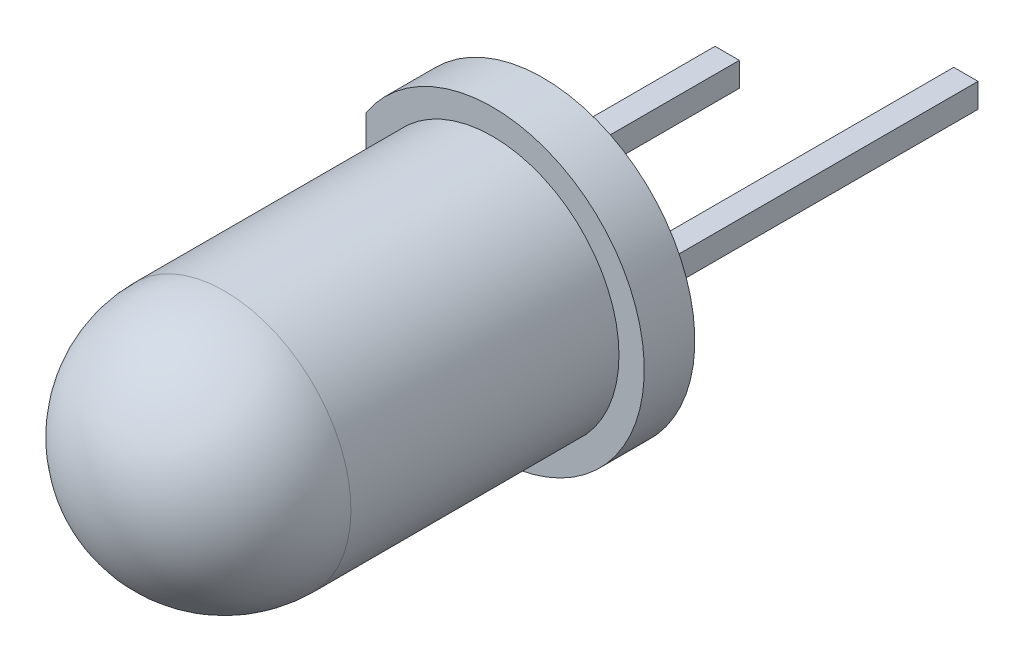
ISO-10303-21;
HEADER;
FILE_DESCRIPTION(('STEP AP214'),'2;1');
FILE_NAME('part.step','',(''),(''),'','','');
FILE_SCHEMA(('AUTOMOTIVE_DESIGN { 1 0 10303 214 1 1 1 1 }'));
ENDSEC;
DATA;
#1=APPLICATION_CONTEXT('core data for automotive mechanical design processes');
#2=APPLICATION_PROTOCOL_DEFINITION('international standard','automotive_design',2000,#1);
#3=PRODUCT_CONTEXT('',#1,'mechanical');
#4=PRODUCT('Part','Part','',(#3));
#5=PRODUCT_RELATED_PRODUCT_CATEGORY('part','',(#4));
#6=PRODUCT_DEFINITION_FORMATION('','',#4);
#7=PRODUCT_DEFINITION_CONTEXT('part definition',#1,'design');
#8=PRODUCT_DEFINITION('design','',#6,#7);
#9=PRODUCT_DEFINITION_SHAPE('','',#8);
#10=(LENGTH_UNIT() NAMED_UNIT(*) SI_UNIT(.MILLI.,.METRE.));
#11=(NAMED_UNIT(*) PLANE_ANGLE_UNIT() SI_UNIT($,.RADIAN.));
#12=(NAMED_UNIT(*) SI_UNIT($,.STERADIAN.) SOLID_ANGLE_UNIT());
#13=UNCERTAINTY_MEASURE_WITH_UNIT(LENGTH_MEASURE(1.E-05),#10,'distance_accuracy_value','');
#14=(GEOMETRIC_REPRESENTATION_CONTEXT(3) GLOBAL_UNCERTAINTY_ASSIGNED_CONTEXT((#13)) GLOBAL_UNIT_ASSIGNED_CONTEXT((#10,
#11,#12)) REPRESENTATION_CONTEXT('',''));
#15=CARTESIAN_POINT('',(0.,0.,0.));
#16=DIRECTION('',(0.,0.,1.));
#17=DIRECTION('',(1.,0.,0.));
#18=AXIS2_PLACEMENT_3D('',#15,#16,#17);
#19=CARTESIAN_POINT('',(-0.0499999999999997,0.,4.26666666666667));
#20=DIRECTION('',(0.,0.,1.));
#21=DIRECTION('',(-1.,0.,0.));
#22=AXIS2_PLACEMENT_3D('',#19,#20,#21);
#23=SPHERICAL_SURFACE('',#22,0.566666666666667);
#24=CARTESIAN_POINT('',(-0.0499999999999997,-0.24,4.26666666666667));
#25=DIRECTION('',(0.,1.,0.));
#26=DIRECTION('',(0.,0.,1.));
#27=AXIS2_PLACEMENT_3D('',#24,#25,#26);
#28=CIRCLE('',#27,0.513333333333333);
#29=CARTESIAN_POINT('',(-0.488634243989226,-0.24,4.));
#30=VERTEX_POINT('',#29);
#31=CARTESIAN_POINT('',(0.388634243989226,-0.24,4.));
#32=VERTEX_POINT('',#31);
#33=EDGE_CURVE('E164',#30,#32,#28,.F.);
#34=ORIENTED_EDGE('',*,*,#33,.T.);
#35=CARTESIAN_POINT('',(-0.0499999999999997,0.,4.));
#36=DIRECTION('',(0.,0.,1.));
#37=DIRECTION('',(1.,0.,0.));
#38=AXIS2_PLACEMENT_3D('',#35,#36,#37);
#39=CIRCLE('',#38,0.5);
#40=EDGE_CURVE('E59',#30,#32,#39,.T.);
#41=ORIENTED_EDGE('',*,*,#40,.F.);
#42=EDGE_LOOP('',(#34,#41));
#43=FACE_BOUND('',#42,.T.);
#44=ADVANCED_FACE('F51',(#43),#23,.T.);
#45=CARTESIAN_POINT('',(0.388634243989226,0.24,4.));
#46=VERTEX_POINT('',#45);
#47=CARTESIAN_POINT('',(-0.488634243989226,0.24,4.));
#48=VERTEX_POINT('',#47);
#49=EDGE_CURVE('E12',#46,#48,#39,.T.);
#50=ORIENTED_EDGE('',*,*,#49,.F.);
#51=CARTESIAN_POINT('',(-0.0499999999999997,0.24,4.26666666666667));
#52=DIRECTION('',(0.,1.,0.));
#53=DIRECTION('',(0.,0.,1.));
#54=AXIS2_PLACEMENT_3D('',#51,#52,#53);
#55=CIRCLE('',#54,0.513333333333333);
#56=EDGE_CURVE('E186',#48,#46,#55,.F.);
#57=ORIENTED_EDGE('',*,*,#56,.F.);
#58=EDGE_LOOP('',(#50,#57));
#59=FACE_BOUND('',#58,.T.);
#60=ADVANCED_FACE('F53',(#59),#23,.T.);
#61=CARTESIAN_POINT('',(-0.55,0.,4.));
#62=DIRECTION('',(0.,0.,-1.));
#63=DIRECTION('',(-1.,0.,0.));
#64=AXIS2_PLACEMENT_3D('',#61,#62,#63);
#65=PLANE('',#64);
#66=CARTESIAN_POINT('',(-0.0499999999999997,0.,4.));
#67=DIRECTION('',(0.,0.,1.));
#68=DIRECTION('',(1.,0.,0.));
#69=AXIS2_PLACEMENT_3D('',#66,#67,#68);
#70=CIRCLE('',#69,0.2);
#71=CARTESIAN_POINT('',(0.15,0.,4.));
#72=VERTEX_POINT('',#71);
#73=EDGE_CURVE('E259',#72,#72,#70,.T.);
#74=ORIENTED_EDGE('',*,*,#73,.F.);
#75=EDGE_LOOP('',(#74));
#76=FACE_BOUND('',#75,.T.);
#77=ORIENTED_EDGE('',*,*,#49,.T.);
#78=DIRECTION('',(1.,0.,0.));
#79=VECTOR('',#78,1.);
#80=CARTESIAN_POINT('',(-1.3,0.24,4.));
#81=LINE('',#80,#79);
#82=CARTESIAN_POINT('',(-1.3,0.24,4.));
#83=VERTEX_POINT('',#82);
#84=EDGE_CURVE('E105',#83,#48,#81,.T.);
#85=ORIENTED_EDGE('',*,*,#84,.F.);
#86=DIRECTION('',(0.,-1.,0.));
#87=VECTOR('',#86,1.);
#88=CARTESIAN_POINT('',(-1.3,0.24,4.));
#89=LINE('',#88,#87);
#90=CARTESIAN_POINT('',(-1.3,-0.24,4.));
#91=VERTEX_POINT('',#90);
#92=EDGE_CURVE('E163',#83,#91,#89,.T.);
#93=ORIENTED_EDGE('',*,*,#92,.T.);
#94=DIRECTION('',(1.,0.,0.));
#95=VECTOR('',#94,1.);
#96=CARTESIAN_POINT('',(-1.3,-0.24,4.));
#97=LINE('',#96,#95);
#98=EDGE_CURVE('E66',#91,#30,#97,.T.);
#99=ORIENTED_EDGE('',*,*,#98,.T.);
#100=ORIENTED_EDGE('',*,*,#40,.T.);
#101=CARTESIAN_POINT('',(1.2,-0.24,4.));
#102=VERTEX_POINT('',#101);
#103=EDGE_CURVE('E149',#32,#102,#97,.T.);
#104=ORIENTED_EDGE('',*,*,#103,.T.);
#105=DIRECTION('',(0.,-1.,0.));
#106=VECTOR('',#105,1.);
#107=CARTESIAN_POINT('',(1.2,0.24,4.));
#108=LINE('',#107,#106);
#109=CARTESIAN_POINT('',(1.2,0.24,4.));
#110=VERTEX_POINT('',#109);
#111=EDGE_CURVE('E133',#110,#102,#108,.T.);
#112=ORIENTED_EDGE('',*,*,#111,.F.);
#113=EDGE_CURVE('E121',#46,#110,#81,.T.);
#114=ORIENTED_EDGE('',*,*,#113,.F.);
#115=EDGE_LOOP('',(#77,#85,#93,#99,#100,#104,#112,#114));
#116=FACE_BOUND('',#115,.T.);
#117=ADVANCED_FACE('F169',(#76,#116),#65,.F.);
#118=CARTESIAN_POINT('',(0.,0.24,0.));
#119=DIRECTION('',(0.,1.,0.));
#120=DIRECTION('',(0.,0.,1.));
#121=AXIS2_PLACEMENT_3D('',#118,#119,#120);
#122=PLANE('',#121);
#123=ORIENTED_EDGE('',*,*,#84,.T.);
#124=ORIENTED_EDGE('',*,*,#56,.T.);
#125=ORIENTED_EDGE('',*,*,#113,.T.);
#126=DIRECTION('',(-0.508148861978286,0.,-0.861269257590315));
#127=VECTOR('',#126,1.);
#128=CARTESIAN_POINT('',(1.2,0.24,4.));
#129=LINE('',#128,#127);
#130=CARTESIAN_POINT('',(0.0199999999999998,0.24,2.));
#131=VERTEX_POINT('',#130);
#132=EDGE_CURVE('E112',#110,#131,#129,.T.);
#133=ORIENTED_EDGE('',*,*,#132,.T.);
#134=DIRECTION('',(-1.,0.,0.));
#135=VECTOR('',#134,1.);
#136=CARTESIAN_POINT('',(0.0199999999999998,0.24,2.));
#137=LINE('',#136,#135);
#138=CARTESIAN_POINT('',(-1.12,0.24,2.));
#139=VERTEX_POINT('',#138);
#140=EDGE_CURVE('E117',#131,#139,#137,.T.);
#141=ORIENTED_EDGE('',*,*,#140,.T.);
#142=DIRECTION('',(0.,0.,-1.));
#143=VECTOR('',#142,1.);
#144=CARTESIAN_POINT('',(-1.12,0.24,2.));
#145=LINE('',#144,#143);
#146=CARTESIAN_POINT('',(-1.12,0.24,-5.));
#147=VERTEX_POINT('',#146);
#148=EDGE_CURVE('E139',#139,#147,#145,.T.);
#149=ORIENTED_EDGE('',*,*,#148,.T.);
#150=DIRECTION('',(1.,0.,0.));
#151=VECTOR('',#150,1.);
#152=CARTESIAN_POINT('',(-1.12,0.24,-5.));
#153=LINE('',#152,#151);
#154=CARTESIAN_POINT('',(-1.6,0.24,-5.));
#155=VERTEX_POINT('',#154);
#156=EDGE_CURVE('E150',#155,#147,#153,.T.);
#157=ORIENTED_EDGE('',*,*,#156,.F.);
#158=DIRECTION('',(0.,0.,1.));
#159=VECTOR('',#158,1.);
#160=CARTESIAN_POINT('',(-1.6,0.24,0.));
#161=LINE('',#160,#159);
#162=CARTESIAN_POINT('',(-1.6,0.24,3.5));
#163=VERTEX_POINT('',#162);
#164=EDGE_CURVE('E75',#155,#163,#161,.T.);
#165=ORIENTED_EDGE('',*,*,#164,.T.);
#166=DIRECTION('',(0.514495755427526,0.,0.857492925712544));
#167=VECTOR('',#166,1.);
#168=CARTESIAN_POINT('',(-1.6,0.24,3.5));
#169=LINE('',#168,#167);
#170=EDGE_CURVE('E159',#163,#83,#169,.T.);
#171=ORIENTED_EDGE('',*,*,#170,.T.);
#172=EDGE_LOOP('',(#123,#124,#125,#133,#141,#149,#157,#165,#171));
#173=FACE_BOUND('',#172,.T.);
#174=ADVANCED_FACE('F114',(#173),#122,.T.);
#175=CARTESIAN_POINT('',(0.,-0.24,0.));
#176=DIRECTION('',(0.,1.,0.));
#177=DIRECTION('',(0.,0.,1.));
#178=AXIS2_PLACEMENT_3D('',#175,#176,#177);
#179=PLANE('',#178);
#180=ORIENTED_EDGE('',*,*,#33,.F.);
#181=ORIENTED_EDGE('',*,*,#98,.F.);
#182=DIRECTION('',(0.514495755427526,0.,0.857492925712544));
#183=VECTOR('',#182,1.);
#184=CARTESIAN_POINT('',(-1.6,-0.24,3.5));
#185=LINE('',#184,#183);
#186=CARTESIAN_POINT('',(-1.6,-0.24,3.5));
#187=VERTEX_POINT('',#186);
#188=EDGE_CURVE('E146',#187,#91,#185,.T.);
#189=ORIENTED_EDGE('',*,*,#188,.F.);
#190=DIRECTION('',(0.,0.,1.));
#191=VECTOR('',#190,1.);
#192=CARTESIAN_POINT('',(-1.6,-0.24,0.));
#193=LINE('',#192,#191);
#194=CARTESIAN_POINT('',(-1.6,-0.24,-5.));
#195=VERTEX_POINT('',#194);
#196=EDGE_CURVE('E99',#195,#187,#193,.T.);
#197=ORIENTED_EDGE('',*,*,#196,.F.);
#198=DIRECTION('',(-1.,0.,0.));
#199=VECTOR('',#198,1.);
#200=CARTESIAN_POINT('',(-1.12,-0.24,-5.));
#201=LINE('',#200,#199);
#202=CARTESIAN_POINT('',(-1.12,-0.24,-5.));
#203=VERTEX_POINT('',#202);
#204=EDGE_CURVE('E207',#203,#195,#201,.T.);
#205=ORIENTED_EDGE('',*,*,#204,.F.);
#206=DIRECTION('',(0.,0.,-1.));
#207=VECTOR('',#206,1.);
#208=CARTESIAN_POINT('',(-1.12,-0.24,2.));
#209=LINE('',#208,#207);
#210=CARTESIAN_POINT('',(-1.12,-0.24,2.));
#211=VERTEX_POINT('',#210);
#212=EDGE_CURVE('E155',#211,#203,#209,.T.);
#213=ORIENTED_EDGE('',*,*,#212,.F.);
#214=DIRECTION('',(-1.,0.,0.));
#215=VECTOR('',#214,1.);
#216=CARTESIAN_POINT('',(0.0199999999999998,-0.24,2.));
#217=LINE('',#216,#215);
#218=CARTESIAN_POINT('',(0.0199999999999998,-0.24,2.));
#219=VERTEX_POINT('',#218);
#220=EDGE_CURVE('E153',#219,#211,#217,.T.);
#221=ORIENTED_EDGE('',*,*,#220,.F.);
#222=DIRECTION('',(-0.508148861978286,0.,-0.861269257590315));
#223=VECTOR('',#222,1.);
#224=CARTESIAN_POINT('',(1.2,-0.24,4.));
#225=LINE('',#224,#223);
#226=EDGE_CURVE('E130',#102,#219,#225,.T.);
#227=ORIENTED_EDGE('',*,*,#226,.F.);
#228=ORIENTED_EDGE('',*,*,#103,.F.);
#229=EDGE_LOOP('',(#180,#181,#189,#197,#205,#213,#221,#227,#228));
#230=FACE_BOUND('',#229,.T.);
#231=ADVANCED_FACE('F221',(#230),#179,.F.);
#232=CARTESIAN_POINT('',(-1.6,0.24,3.5));
#233=DIRECTION('',(0.857492925712544,0.,-0.514495755427526));
#234=DIRECTION('',(-0.514495755427526,0.,-0.857492925712544));
#235=AXIS2_PLACEMENT_3D('',#232,#233,#234);
#236=PLANE('',#235);
#237=ORIENTED_EDGE('',*,*,#188,.T.);
#238=ORIENTED_EDGE('',*,*,#92,.F.);
#239=ORIENTED_EDGE('',*,*,#170,.F.);
#240=DIRECTION('',(0.,-1.,0.));
#241=VECTOR('',#240,1.);
#242=CARTESIAN_POINT('',(-1.6,0.24,3.5));
#243=LINE('',#242,#241);
#244=EDGE_CURVE('E145',#163,#187,#243,.T.);
#245=ORIENTED_EDGE('',*,*,#244,.T.);
#246=EDGE_LOOP('',(#237,#238,#239,#245));
#247=FACE_BOUND('',#246,.T.);
#248=ADVANCED_FACE('F218',(#247),#236,.F.);
#249=CARTESIAN_POINT('',(1.2,0.24,4.));
#250=DIRECTION('',(-0.861269257590315,0.,0.508148861978286));
#251=DIRECTION('',(0.508148861978286,0.,0.861269257590315));
#252=AXIS2_PLACEMENT_3D('',#249,#250,#251);
#253=PLANE('',#252);
#254=ORIENTED_EDGE('',*,*,#226,.T.);
#255=DIRECTION('',(0.,-1.,0.));
#256=VECTOR('',#255,1.);
#257=CARTESIAN_POINT('',(0.0199999999999998,0.24,2.));
#258=LINE('',#257,#256);
#259=EDGE_CURVE('E127',#131,#219,#258,.T.);
#260=ORIENTED_EDGE('',*,*,#259,.F.);
#261=ORIENTED_EDGE('',*,*,#132,.F.);
#262=ORIENTED_EDGE('',*,*,#111,.T.);
#263=EDGE_LOOP('',(#254,#260,#261,#262));
#264=FACE_BOUND('',#263,.T.);
#265=ADVANCED_FACE('F128',(#264),#253,.F.);
#266=CARTESIAN_POINT('',(0.0199999999999998,0.24,2.));
#267=DIRECTION('',(0.,0.,1.));
#268=DIRECTION('',(1.,0.,0.));
#269=AXIS2_PLACEMENT_3D('',#266,#267,#268);
#270=PLANE('',#269);
#271=ORIENTED_EDGE('',*,*,#220,.T.);
#272=DIRECTION('',(0.,-1.,0.));
#273=VECTOR('',#272,1.);
#274=CARTESIAN_POINT('',(-1.12,0.24,2.));
#275=LINE('',#274,#273);
#276=EDGE_CURVE('E134',#139,#211,#275,.T.);
#277=ORIENTED_EDGE('',*,*,#276,.F.);
#278=ORIENTED_EDGE('',*,*,#140,.F.);
#279=ORIENTED_EDGE('',*,*,#259,.T.);
#280=EDGE_LOOP('',(#271,#277,#278,#279));
#281=FACE_BOUND('',#280,.T.);
#282=ADVANCED_FACE('F136',(#281),#270,.F.);
#283=CARTESIAN_POINT('',(-1.12,0.24,2.));
#284=DIRECTION('',(-1.,0.,0.));
#285=DIRECTION('',(0.,0.,1.));
#286=AXIS2_PLACEMENT_3D('',#283,#284,#285);
#287=PLANE('',#286);
#288=ORIENTED_EDGE('',*,*,#212,.T.);
#289=DIRECTION('',(0.,-1.,0.));
#290=VECTOR('',#289,1.);
#291=CARTESIAN_POINT('',(-1.12,-0.24,-5.));
#292=LINE('',#291,#290);
#293=EDGE_CURVE('E201',#147,#203,#292,.T.);
#294=ORIENTED_EDGE('',*,*,#293,.F.);
#295=ORIENTED_EDGE('',*,*,#148,.F.);
#296=ORIENTED_EDGE('',*,*,#276,.T.);
#297=EDGE_LOOP('',(#288,#294,#295,#296));
#298=FACE_BOUND('',#297,.T.);
#299=ADVANCED_FACE('F204',(#298),#287,.F.);
#300=CARTESIAN_POINT('',(-1.6,0.24,0.));
#301=DIRECTION('',(1.,0.,0.));
#302=DIRECTION('',(0.,0.,-1.));
#303=AXIS2_PLACEMENT_3D('',#300,#301,#302);
#304=PLANE('',#303);
#305=ORIENTED_EDGE('',*,*,#196,.T.);
#306=ORIENTED_EDGE('',*,*,#244,.F.);
#307=ORIENTED_EDGE('',*,*,#164,.F.);
#308=DIRECTION('',(0.,1.,0.));
#309=VECTOR('',#308,1.);
#310=CARTESIAN_POINT('',(-1.6,-0.24,-5.));
#311=LINE('',#310,#309);
#312=EDGE_CURVE('E202',#195,#155,#311,.T.);
#313=ORIENTED_EDGE('',*,*,#312,.F.);
#314=EDGE_LOOP('',(#305,#306,#307,#313));
#315=FACE_BOUND('',#314,.T.);
#316=ADVANCED_FACE('F222',(#315),#304,.F.);
#317=CARTESIAN_POINT('',(0.,0.,-5.));
#318=DIRECTION('',(0.,0.,1.));
#319=DIRECTION('',(1.,0.,0.));
#320=AXIS2_PLACEMENT_3D('',#317,#318,#319);
#321=PLANE('',#320);
#322=ORIENTED_EDGE('',*,*,#293,.T.);
#323=ORIENTED_EDGE('',*,*,#204,.T.);
#324=ORIENTED_EDGE('',*,*,#312,.T.);
#325=ORIENTED_EDGE('',*,*,#156,.T.);
#326=EDGE_LOOP('',(#322,#323,#324,#325));
#327=FACE_BOUND('',#326,.T.);
#328=ADVANCED_FACE('F199',(#327),#321,.F.);
#329=CARTESIAN_POINT('',(-0.0499999999999997,0.,3.9));
#330=DIRECTION('',(0.,0.,1.));
#331=DIRECTION('',(1.,0.,0.));
#332=AXIS2_PLACEMENT_3D('',#329,#330,#331);
#333=CYLINDRICAL_SURFACE('',#332,0.2);
#334=CARTESIAN_POINT('',(-0.0499999999999997,0.,3.9));
#335=DIRECTION('',(0.,0.,1.));
#336=DIRECTION('',(1.,0.,0.));
#337=AXIS2_PLACEMENT_3D('',#334,#335,#336);
#338=CIRCLE('',#337,0.2);
#339=CARTESIAN_POINT('',(0.15,0.,3.9));
#340=VERTEX_POINT('',#339);
#341=EDGE_CURVE('E210',#340,#340,#338,.T.);
#342=ORIENTED_EDGE('',*,*,#341,.F.);
#343=EDGE_LOOP('',(#342));
#344=FACE_BOUND('',#343,.T.);
#345=ORIENTED_EDGE('',*,*,#73,.T.);
#346=EDGE_LOOP('',(#345));
#347=FACE_BOUND('',#346,.T.);
#348=ADVANCED_FACE('F229',(#344,#347),#333,.F.);
#349=CARTESIAN_POINT('',(-0.0499999999999997,0.,3.9));
#350=DIRECTION('',(0.,0.,1.));
#351=DIRECTION('',(1.,0.,0.));
#352=AXIS2_PLACEMENT_3D('',#349,#350,#351);
#353=PLANE('',#352);
#354=ORIENTED_EDGE('',*,*,#341,.T.);
#355=EDGE_LOOP('',(#354));
#356=FACE_BOUND('',#355,.T.);
#357=ADVANCED_FACE('F251',(#356),#353,.T.);
#358=CLOSED_SHELL('',(#44,#60,#117,#174,#231,#248,#265,#282,#299,#316,#328,#348,#357));
#359=MANIFOLD_SOLID_BREP('B2',#358);
#360=CARTESIAN_POINT('',(1.12,0.24,2.));
#361=DIRECTION('',(0.,0.,1.));
#362=DIRECTION('',(1.,0.,0.));
#363=AXIS2_PLACEMENT_3D('',#360,#361,#362);
#364=PLANE('',#363);
#365=DIRECTION('',(-1.,0.,0.));
#366=VECTOR('',#365,1.);
#367=CARTESIAN_POINT('',(1.12,-0.24,2.));
#368=LINE('',#367,#366);
#369=CARTESIAN_POINT('',(1.12,-0.24,2.));
#370=VERTEX_POINT('',#369);
#371=CARTESIAN_POINT('',(0.22,-0.24,2.));
#372=VERTEX_POINT('',#371);
#373=EDGE_CURVE('E456',#370,#372,#368,.T.);
#374=ORIENTED_EDGE('',*,*,#373,.T.);
#375=DIRECTION('',(0.,-1.,0.));
#376=VECTOR('',#375,1.);
#377=CARTESIAN_POINT('',(0.22,0.24,2.));
#378=LINE('',#377,#376);
#379=CARTESIAN_POINT('',(0.22,0.24,2.));
#380=VERTEX_POINT('',#379);
#381=EDGE_CURVE('E49',#380,#372,#378,.T.);
#382=ORIENTED_EDGE('',*,*,#381,.F.);
#383=DIRECTION('',(-1.,0.,0.));
#384=VECTOR('',#383,1.);
#385=CARTESIAN_POINT('',(1.12,0.24,2.));
#386=LINE('',#385,#384);
#387=CARTESIAN_POINT('',(1.12,0.24,2.));
#388=VERTEX_POINT('',#387);
#389=EDGE_CURVE('E457',#388,#380,#386,.T.);
#390=ORIENTED_EDGE('',*,*,#389,.F.);
#391=DIRECTION('',(0.,-1.,0.));
#392=VECTOR('',#391,1.);
#393=CARTESIAN_POINT('',(1.12,0.24,2.));
#394=LINE('',#393,#392);
#395=EDGE_CURVE('E462',#388,#370,#394,.T.);
#396=ORIENTED_EDGE('',*,*,#395,.T.);
#397=EDGE_LOOP('',(#374,#382,#390,#396));
#398=FACE_BOUND('',#397,.T.);
#399=ADVANCED_FACE('F370',(#398),#364,.F.);
#400=CARTESIAN_POINT('',(0.22,0.24,2.));
#401=DIRECTION('',(0.861269257590315,0.,-0.508148861978286));
#402=DIRECTION('',(-0.508148861978286,0.,-0.861269257590315));
#403=AXIS2_PLACEMENT_3D('',#400,#401,#402);
#404=PLANE('',#403);
#405=DIRECTION('',(0.508148861978286,0.,0.861269257590315));
#406=VECTOR('',#405,1.);
#407=CARTESIAN_POINT('',(0.22,-0.24,2.));
#408=LINE('',#407,#406);
#409=CARTESIAN_POINT('',(1.4,-0.24,4.));
#410=VERTEX_POINT('',#409);
#411=EDGE_CURVE('E465',#372,#410,#408,.T.);
#412=ORIENTED_EDGE('',*,*,#411,.T.);
#413=DIRECTION('',(0.,-1.,0.));
#414=VECTOR('',#413,1.);
#415=CARTESIAN_POINT('',(1.4,0.24,4.));
#416=LINE('',#415,#414);
#417=CARTESIAN_POINT('',(1.4,0.24,4.));
#418=VERTEX_POINT('',#417);
#419=EDGE_CURVE('E378',#418,#410,#416,.T.);
#420=ORIENTED_EDGE('',*,*,#419,.F.);
#421=DIRECTION('',(0.508148861978286,0.,0.861269257590315));
#422=VECTOR('',#421,1.);
#423=CARTESIAN_POINT('',(0.22,0.24,2.));
#424=LINE('',#423,#422);
#425=EDGE_CURVE('E419',#380,#418,#424,.T.);
#426=ORIENTED_EDGE('',*,*,#425,.F.);
#427=ORIENTED_EDGE('',*,*,#381,.T.);
#428=EDGE_LOOP('',(#412,#420,#426,#427));
#429=FACE_BOUND('',#428,.T.);
#430=ADVANCED_FACE('F480',(#429),#404,.F.);
#431=CARTESIAN_POINT('',(1.4,0.24,4.));
#432=DIRECTION('',(0.,0.,-1.));
#433=DIRECTION('',(-1.,0.,0.));
#434=AXIS2_PLACEMENT_3D('',#431,#432,#433);
#435=PLANE('',#434);
#436=DIRECTION('',(1.,0.,0.));
#437=VECTOR('',#436,1.);
#438=CARTESIAN_POINT('',(1.4,-0.24,4.));
#439=LINE('',#438,#437);
#440=CARTESIAN_POINT('',(1.6,-0.24,4.));
#441=VERTEX_POINT('',#440);
#442=EDGE_CURVE('E405',#410,#441,#439,.T.);
#443=ORIENTED_EDGE('',*,*,#442,.T.);
#444=DIRECTION('',(0.,-1.,0.));
#445=VECTOR('',#444,1.);
#446=CARTESIAN_POINT('',(1.6,0.24,4.));
#447=LINE('',#446,#445);
#448=CARTESIAN_POINT('',(1.6,0.24,4.));
#449=VERTEX_POINT('',#448);
#450=EDGE_CURVE('E471',#449,#441,#447,.T.);
#451=ORIENTED_EDGE('',*,*,#450,.F.);
#452=DIRECTION('',(1.,0.,0.));
#453=VECTOR('',#452,1.);
#454=CARTESIAN_POINT('',(1.4,0.24,4.));
#455=LINE('',#454,#453);
#456=EDGE_CURVE('E436',#418,#449,#455,.T.);
#457=ORIENTED_EDGE('',*,*,#456,.F.);
#458=ORIENTED_EDGE('',*,*,#419,.T.);
#459=EDGE_LOOP('',(#443,#451,#457,#458));
#460=FACE_BOUND('',#459,.T.);
#461=ADVANCED_FACE('F472',(#460),#435,.F.);
#462=CARTESIAN_POINT('',(1.6,0.24,4.));
#463=DIRECTION('',(-1.,0.,0.));
#464=DIRECTION('',(0.,0.,1.));
#465=AXIS2_PLACEMENT_3D('',#462,#463,#464);
#466=PLANE('',#465);
#467=DIRECTION('',(0.,0.,-1.));
#468=VECTOR('',#467,1.);
#469=CARTESIAN_POINT('',(1.6,-0.24,4.));
#470=LINE('',#469,#468);
#471=CARTESIAN_POINT('',(1.6,-0.24,-7.));
#472=VERTEX_POINT('',#471);
#473=EDGE_CURVE('E443',#441,#472,#470,.T.);
#474=ORIENTED_EDGE('',*,*,#473,.T.);
#475=DIRECTION('',(0.,-1.,0.));
#476=VECTOR('',#475,1.);
#477=CARTESIAN_POINT('',(1.6,0.24,-7.));
#478=LINE('',#477,#476);
#479=CARTESIAN_POINT('',(1.6,0.24,-7.));
#480=VERTEX_POINT('',#479);
#481=EDGE_CURVE('E440',#480,#472,#478,.T.);
#482=ORIENTED_EDGE('',*,*,#481,.F.);
#483=DIRECTION('',(0.,0.,-1.));
#484=VECTOR('',#483,1.);
#485=CARTESIAN_POINT('',(1.6,0.24,4.));
#486=LINE('',#485,#484);
#487=EDGE_CURVE('E430',#449,#480,#486,.T.);
#488=ORIENTED_EDGE('',*,*,#487,.F.);
#489=ORIENTED_EDGE('',*,*,#450,.T.);
#490=EDGE_LOOP('',(#474,#482,#488,#489));
#491=FACE_BOUND('',#490,.T.);
#492=ADVANCED_FACE('F441',(#491),#466,.F.);
#493=CARTESIAN_POINT('',(1.12,0.24,0.));
#494=DIRECTION('',(1.,0.,0.));
#495=DIRECTION('',(0.,0.,-1.));
#496=AXIS2_PLACEMENT_3D('',#493,#494,#495);
#497=PLANE('',#496);
#498=DIRECTION('',(0.,0.,1.));
#499=VECTOR('',#498,1.);
#500=CARTESIAN_POINT('',(1.12,-0.24,0.));
#501=LINE('',#500,#499);
#502=CARTESIAN_POINT('',(1.12,-0.24,-7.));
#503=VERTEX_POINT('',#502);
#504=EDGE_CURVE('E412',#503,#370,#501,.T.);
#505=ORIENTED_EDGE('',*,*,#504,.T.);
#506=ORIENTED_EDGE('',*,*,#395,.F.);
#507=DIRECTION('',(0.,0.,1.));
#508=VECTOR('',#507,1.);
#509=CARTESIAN_POINT('',(1.12,0.24,0.));
#510=LINE('',#509,#508);
#511=CARTESIAN_POINT('',(1.12,0.24,-7.));
#512=VERTEX_POINT('',#511);
#513=EDGE_CURVE('E386',#512,#388,#510,.T.);
#514=ORIENTED_EDGE('',*,*,#513,.F.);
#515=DIRECTION('',(0.,1.,0.));
#516=VECTOR('',#515,1.);
#517=CARTESIAN_POINT('',(1.12,-0.24,-7.));
#518=LINE('',#517,#516);
#519=EDGE_CURVE('E451',#503,#512,#518,.T.);
#520=ORIENTED_EDGE('',*,*,#519,.F.);
#521=EDGE_LOOP('',(#505,#506,#514,#520));
#522=FACE_BOUND('',#521,.T.);
#523=ADVANCED_FACE('F476',(#522),#497,.F.);
#524=CARTESIAN_POINT('',(0.,0.24,0.));
#525=DIRECTION('',(0.,-1.,0.));
#526=DIRECTION('',(0.,0.,-1.));
#527=AXIS2_PLACEMENT_3D('',#524,#525,#526);
#528=PLANE('',#527);
#529=ORIENTED_EDGE('',*,*,#389,.T.);
#530=ORIENTED_EDGE('',*,*,#425,.T.);
#531=ORIENTED_EDGE('',*,*,#456,.T.);
#532=ORIENTED_EDGE('',*,*,#487,.T.);
#533=DIRECTION('',(1.,0.,0.));
#534=VECTOR('',#533,1.);
#535=CARTESIAN_POINT('',(1.12,0.24,-7.));
#536=LINE('',#535,#534);
#537=EDGE_CURVE('E434',#512,#480,#536,.T.);
#538=ORIENTED_EDGE('',*,*,#537,.F.);
#539=ORIENTED_EDGE('',*,*,#513,.T.);
#540=EDGE_LOOP('',(#529,#530,#531,#532,#538,#539));
#541=FACE_BOUND('',#540,.T.);
#542=ADVANCED_FACE('F432',(#541),#528,.F.);
#543=CARTESIAN_POINT('',(0.,-0.24,0.));
#544=DIRECTION('',(0.,-1.,0.));
#545=DIRECTION('',(0.,0.,-1.));
#546=AXIS2_PLACEMENT_3D('',#543,#544,#545);
#547=PLANE('',#546);
#548=ORIENTED_EDGE('',*,*,#373,.F.);
#549=ORIENTED_EDGE('',*,*,#504,.F.);
#550=DIRECTION('',(-1.,0.,0.));
#551=VECTOR('',#550,1.);
#552=CARTESIAN_POINT('',(1.6,-0.24,-7.));
#553=LINE('',#552,#551);
#554=EDGE_CURVE('E447',#472,#503,#553,.T.);
#555=ORIENTED_EDGE('',*,*,#554,.F.);
#556=ORIENTED_EDGE('',*,*,#473,.F.);
#557=ORIENTED_EDGE('',*,*,#442,.F.);
#558=ORIENTED_EDGE('',*,*,#411,.F.);
#559=EDGE_LOOP('',(#548,#549,#555,#556,#557,#558));
#560=FACE_BOUND('',#559,.T.);
#561=ADVANCED_FACE('F475',(#560),#547,.T.);
#562=CARTESIAN_POINT('',(0.,0.,-7.));
#563=DIRECTION('',(0.,0.,-1.));
#564=DIRECTION('',(-1.,0.,0.));
#565=AXIS2_PLACEMENT_3D('',#562,#563,#564);
#566=PLANE('',#565);
#567=ORIENTED_EDGE('',*,*,#537,.T.);
#568=ORIENTED_EDGE('',*,*,#481,.T.);
#569=ORIENTED_EDGE('',*,*,#554,.T.);
#570=ORIENTED_EDGE('',*,*,#519,.T.);
#571=EDGE_LOOP('',(#567,#568,#569,#570));
#572=FACE_BOUND('',#571,.T.);
#573=ADVANCED_FACE('F450',(#572),#566,.T.);
#574=CLOSED_SHELL('',(#399,#430,#461,#492,#523,#542,#561,#573));
#575=MANIFOLD_SOLID_BREP('B6',#574);
#576=CARTESIAN_POINT('',(0.,0.,1.));
#577=DIRECTION('',(0.,0.,-1.));
#578=DIRECTION('',(-1.,0.,0.));
#579=AXIS2_PLACEMENT_3D('',#576,#577,#578);
#580=CYLINDRICAL_SURFACE('',#579,3.);
#581=CARTESIAN_POINT('',(0.,0.,1.));
#582=DIRECTION('',(0.,0.,1.));
#583=DIRECTION('',(1.,0.,0.));
#584=AXIS2_PLACEMENT_3D('',#581,#582,#583);
#585=CIRCLE('',#584,3.);
#586=CARTESIAN_POINT('',(-2.5,-1.6583123951777,1.));
#587=VERTEX_POINT('',#586);
#588=CARTESIAN_POINT('',(-2.5,1.6583123951777,1.));
#589=VERTEX_POINT('',#588);
#590=EDGE_CURVE('E581',#587,#589,#585,.T.);
#591=ORIENTED_EDGE('',*,*,#590,.F.);
#592=DIRECTION('',(0.,0.,-1.));
#593=VECTOR('',#592,1.);
#594=CARTESIAN_POINT('',(-2.5,-1.6583123951777,4.35410196624969));
#595=LINE('',#594,#593);
#596=CARTESIAN_POINT('',(-2.5,-1.6583123951777,0.));
#597=VERTEX_POINT('',#596);
#598=EDGE_CURVE('E779',#587,#597,#595,.T.);
#599=ORIENTED_EDGE('',*,*,#598,.T.);
#600=CARTESIAN_POINT('',(0.,0.,0.));
#601=DIRECTION('',(0.,0.,1.));
#602=DIRECTION('',(1.,0.,0.));
#603=AXIS2_PLACEMENT_3D('',#600,#601,#602);
#604=CIRCLE('',#603,3.);
#605=CARTESIAN_POINT('',(-2.5,1.6583123951777,0.));
#606=VERTEX_POINT('',#605);
#607=EDGE_CURVE('E787',#597,#606,#604,.T.);
#608=ORIENTED_EDGE('',*,*,#607,.T.);
#609=DIRECTION('',(0.,0.,-1.));
#610=VECTOR('',#609,1.);
#611=CARTESIAN_POINT('',(-2.5,1.6583123951777,4.35410196624969));
#612=LINE('',#611,#610);
#613=EDGE_CURVE('E782',#589,#606,#612,.T.);
#614=ORIENTED_EDGE('',*,*,#613,.F.);
#615=EDGE_LOOP('',(#591,#599,#608,#614));
#616=FACE_BOUND('',#615,.T.);
#617=ADVANCED_FACE('F574',(#616),#580,.T.);
#618=CARTESIAN_POINT('',(0.,0.,1.));
#619=DIRECTION('',(0.,0.,1.));
#620=DIRECTION('',(1.,0.,0.));
#621=AXIS2_PLACEMENT_3D('',#618,#619,#620);
#622=PLANE('',#621);
#623=DIRECTION('',(0.,-1.,0.));
#624=VECTOR('',#623,1.);
#625=CARTESIAN_POINT('',(-2.5,1.6583123951777,1.));
#626=LINE('',#625,#624);
#627=CARTESIAN_POINT('',(-2.5,0.,1.));
#628=VERTEX_POINT('',#627);
#629=EDGE_CURVE('E775',#628,#587,#626,.T.);
#630=ORIENTED_EDGE('',*,*,#629,.T.);
#631=ORIENTED_EDGE('',*,*,#590,.T.);
#632=EDGE_CURVE('E776',#589,#628,#626,.T.);
#633=ORIENTED_EDGE('',*,*,#632,.T.);
#634=CARTESIAN_POINT('',(0.,0.,1.));
#635=DIRECTION('',(0.,0.,1.));
#636=DIRECTION('',(1.,0.,0.));
#637=AXIS2_PLACEMENT_3D('',#634,#635,#636);
#638=CIRCLE('',#637,2.5);
#639=EDGE_CURVE('E368',#628,#628,#638,.T.);
#640=ORIENTED_EDGE('',*,*,#639,.F.);
#641=EDGE_LOOP('',(#630,#631,#633,#640));
#642=FACE_BOUND('',#641,.T.);
#643=ADVANCED_FACE('F801',(#642),#622,.T.);
#644=CARTESIAN_POINT('',(0.,0.,0.));
#645=DIRECTION('',(0.,0.,1.));
#646=DIRECTION('',(1.,0.,0.));
#647=AXIS2_PLACEMENT_3D('',#644,#645,#646);
#648=PLANE('',#647);
#649=DIRECTION('',(0.,1.,0.));
#650=VECTOR('',#649,1.);
#651=CARTESIAN_POINT('',(1.12,-0.24,0.));
#652=LINE('',#651,#650);
#653=CARTESIAN_POINT('',(1.12,-0.24,0.));
#654=VERTEX_POINT('',#653);
#655=CARTESIAN_POINT('',(1.12,0.24,0.));
#656=VERTEX_POINT('',#655);
#657=EDGE_CURVE('E688',#654,#656,#652,.T.);
#658=ORIENTED_EDGE('',*,*,#657,.F.);
#659=DIRECTION('',(-1.,0.,0.));
#660=VECTOR('',#659,1.);
#661=CARTESIAN_POINT('',(1.12,-0.24,0.));
#662=LINE('',#661,#660);
#663=CARTESIAN_POINT('',(1.6,-0.24,0.));
#664=VERTEX_POINT('',#663);
#665=EDGE_CURVE('E695',#664,#654,#662,.T.);
#666=ORIENTED_EDGE('',*,*,#665,.F.);
#667=DIRECTION('',(0.,1.,0.));
#668=VECTOR('',#667,1.);
#669=CARTESIAN_POINT('',(1.6,-0.24,0.));
#670=LINE('',#669,#668);
#671=CARTESIAN_POINT('',(1.6,0.24,0.));
#672=VERTEX_POINT('',#671);
#673=EDGE_CURVE('E743',#664,#672,#670,.T.);
#674=ORIENTED_EDGE('',*,*,#673,.T.);
#675=DIRECTION('',(-1.,0.,0.));
#676=VECTOR('',#675,1.);
#677=CARTESIAN_POINT('',(1.12,0.24,0.));
#678=LINE('',#677,#676);
#679=EDGE_CURVE('E709',#672,#656,#678,.T.);
#680=ORIENTED_EDGE('',*,*,#679,.T.);
#681=EDGE_LOOP('',(#658,#666,#674,#680));
#682=FACE_BOUND('',#681,.T.);
#683=DIRECTION('',(0.,1.,0.));
#684=VECTOR('',#683,1.);
#685=CARTESIAN_POINT('',(-1.6,-0.24,0.));
#686=LINE('',#685,#684);
#687=CARTESIAN_POINT('',(-1.6,-0.24,0.));
#688=VERTEX_POINT('',#687);
#689=CARTESIAN_POINT('',(-1.6,0.24,0.));
#690=VERTEX_POINT('',#689);
#691=EDGE_CURVE('E739',#688,#690,#686,.T.);
#692=ORIENTED_EDGE('',*,*,#691,.F.);
#693=DIRECTION('',(-1.,0.,0.));
#694=VECTOR('',#693,1.);
#695=CARTESIAN_POINT('',(-1.6,-0.24,0.));
#696=LINE('',#695,#694);
#697=CARTESIAN_POINT('',(-1.12,-0.24,0.));
#698=VERTEX_POINT('',#697);
#699=EDGE_CURVE('E717',#698,#688,#696,.T.);
#700=ORIENTED_EDGE('',*,*,#699,.F.);
#701=DIRECTION('',(0.,1.,0.));
#702=VECTOR('',#701,1.);
#703=CARTESIAN_POINT('',(-1.12,-0.24,0.));
#704=LINE('',#703,#702);
#705=CARTESIAN_POINT('',(-1.12,0.24,0.));
#706=VERTEX_POINT('',#705);
#707=EDGE_CURVE('E759',#698,#706,#704,.T.);
#708=ORIENTED_EDGE('',*,*,#707,.T.);
#709=DIRECTION('',(-1.,0.,0.));
#710=VECTOR('',#709,1.);
#711=CARTESIAN_POINT('',(-1.6,0.24,0.));
#712=LINE('',#711,#710);
#713=EDGE_CURVE('E740',#706,#690,#712,.T.);
#714=ORIENTED_EDGE('',*,*,#713,.T.);
#715=EDGE_LOOP('',(#692,#700,#708,#714));
#716=FACE_BOUND('',#715,.T.);
#717=ORIENTED_EDGE('',*,*,#607,.F.);
#718=DIRECTION('',(0.,-1.,0.));
#719=VECTOR('',#718,1.);
#720=CARTESIAN_POINT('',(-2.5,1.6583123951777,0.));
#721=LINE('',#720,#719);
#722=EDGE_CURVE('E762',#606,#597,#721,.T.);
#723=ORIENTED_EDGE('',*,*,#722,.F.);
#724=EDGE_LOOP('',(#717,#723));
#725=FACE_BOUND('',#724,.T.);
#726=ADVANCED_FACE('F707',(#682,#716,#725),#648,.F.);
#727=CARTESIAN_POINT('',(0.,0.,6.3));
#728=DIRECTION('',(0.,0.,-1.));
#729=DIRECTION('',(0.,1.,0.));
#730=AXIS2_PLACEMENT_3D('',#727,#728,#729);
#731=SPHERICAL_SURFACE('',#730,2.5);
#732=CARTESIAN_POINT('',(0.,0.,6.3));
#733=DIRECTION('',(0.,0.,-1.));
#734=DIRECTION('',(0.,1.,0.));
#735=AXIS2_PLACEMENT_3D('',#732,#733,#734);
#736=CIRCLE('',#735,2.5);
#737=CARTESIAN_POINT('',(0.,2.5,6.3));
#738=VERTEX_POINT('',#737);
#739=EDGE_CURVE('E784',#738,#738,#736,.T.);
#740=ORIENTED_EDGE('',*,*,#739,.F.);
#741=EDGE_LOOP('',(#740));
#742=FACE_BOUND('',#741,.T.);
#743=ADVANCED_FACE('F805',(#742),#731,.T.);
#744=CARTESIAN_POINT('',(0.,0.,1.));
#745=DIRECTION('',(0.,0.,-1.));
#746=DIRECTION('',(0.,1.,0.));
#747=AXIS2_PLACEMENT_3D('',#744,#745,#746);
#748=CYLINDRICAL_SURFACE('',#747,2.5);
#749=ORIENTED_EDGE('',*,*,#739,.T.);
#750=EDGE_LOOP('',(#749));
#751=FACE_BOUND('',#750,.T.);
#752=ORIENTED_EDGE('',*,*,#639,.T.);
#753=EDGE_LOOP('',(#752));
#754=FACE_BOUND('',#753,.T.);
#755=ADVANCED_FACE('F803',(#751,#754),#748,.T.);
#756=CARTESIAN_POINT('',(-2.5,1.6583123951777,4.35410196624969));
#757=DIRECTION('',(1.,0.,0.));
#758=DIRECTION('',(0.,0.,-1.));
#759=AXIS2_PLACEMENT_3D('',#756,#757,#758);
#760=PLANE('',#759);
#761=ORIENTED_EDGE('',*,*,#613,.T.);
#762=ORIENTED_EDGE('',*,*,#722,.T.);
#763=ORIENTED_EDGE('',*,*,#598,.F.);
#764=ORIENTED_EDGE('',*,*,#629,.F.);
#765=ORIENTED_EDGE('',*,*,#632,.F.);
#766=EDGE_LOOP('',(#761,#762,#763,#764,#765));
#767=FACE_BOUND('',#766,.T.);
#768=ADVANCED_FACE('F797',(#767),#760,.F.);
#769=CARTESIAN_POINT('',(-1.12,-0.24,0.));
#770=DIRECTION('',(1.,0.,0.));
#771=DIRECTION('',(0.,0.,-1.));
#772=AXIS2_PLACEMENT_3D('',#769,#770,#771);
#773=PLANE('',#772);
#774=DIRECTION('',(0.,0.,-1.));
#775=VECTOR('',#774,1.);
#776=CARTESIAN_POINT('',(-1.12,0.24,0.));
#777=LINE('',#776,#775);
#778=CARTESIAN_POINT('',(-1.12,0.24,2.));
#779=VERTEX_POINT('',#778);
#780=EDGE_CURVE('E721',#779,#706,#777,.T.);
#781=ORIENTED_EDGE('',*,*,#780,.T.);
#782=ORIENTED_EDGE('',*,*,#707,.F.);
#783=DIRECTION('',(0.,0.,-1.));
#784=VECTOR('',#783,1.);
#785=CARTESIAN_POINT('',(-1.12,-0.24,0.));
#786=LINE('',#785,#784);
#787=CARTESIAN_POINT('',(-1.12,-0.24,2.));
#788=VERTEX_POINT('',#787);
#789=EDGE_CURVE('E736',#788,#698,#786,.T.);
#790=ORIENTED_EDGE('',*,*,#789,.F.);
#791=DIRECTION('',(0.,1.,0.));
#792=VECTOR('',#791,1.);
#793=CARTESIAN_POINT('',(-1.12,-0.24,2.));
#794=LINE('',#793,#792);
#795=EDGE_CURVE('E763',#788,#779,#794,.T.);
#796=ORIENTED_EDGE('',*,*,#795,.T.);
#797=EDGE_LOOP('',(#781,#782,#790,#796));
#798=FACE_BOUND('',#797,.T.);
#799=ADVANCED_FACE('F812',(#798),#773,.F.);
#800=CARTESIAN_POINT('',(-1.12,-0.24,2.));
#801=DIRECTION('',(0.,0.,-1.));
#802=DIRECTION('',(-1.,0.,0.));
#803=AXIS2_PLACEMENT_3D('',#800,#801,#802);
#804=PLANE('',#803);
#805=DIRECTION('',(-1.,0.,0.));
#806=VECTOR('',#805,1.);
#807=CARTESIAN_POINT('',(-1.12,0.24,2.));
#808=LINE('',#807,#806);
#809=CARTESIAN_POINT('',(0.0199999999999998,0.24,2.));
#810=VERTEX_POINT('',#809);
#811=EDGE_CURVE('E754',#810,#779,#808,.T.);
#812=ORIENTED_EDGE('',*,*,#811,.T.);
#813=ORIENTED_EDGE('',*,*,#795,.F.);
#814=DIRECTION('',(-1.,0.,0.));
#815=VECTOR('',#814,1.);
#816=CARTESIAN_POINT('',(-1.12,-0.24,2.));
#817=LINE('',#816,#815);
#818=CARTESIAN_POINT('',(0.0199999999999998,-0.24,2.));
#819=VERTEX_POINT('',#818);
#820=EDGE_CURVE('E733',#819,#788,#817,.T.);
#821=ORIENTED_EDGE('',*,*,#820,.F.);
#822=DIRECTION('',(0.,1.,0.));
#823=VECTOR('',#822,1.);
#824=CARTESIAN_POINT('',(0.0199999999999998,-0.24,2.));
#825=LINE('',#824,#823);
#826=EDGE_CURVE('E765',#819,#810,#825,.T.);
#827=ORIENTED_EDGE('',*,*,#826,.T.);
#828=EDGE_LOOP('',(#812,#813,#821,#827));
#829=FACE_BOUND('',#828,.T.);
#830=ADVANCED_FACE('F857',(#829),#804,.F.);
#831=CARTESIAN_POINT('',(0.0199999999999998,-0.24,2.));
#832=DIRECTION('',(0.861269257590315,0.,-0.508148861978286));
#833=DIRECTION('',(-0.508148861978286,0.,-0.861269257590315));
#834=AXIS2_PLACEMENT_3D('',#831,#832,#833);
#835=PLANE('',#834);
#836=DIRECTION('',(-0.508148861978286,0.,-0.861269257590315));
#837=VECTOR('',#836,1.);
#838=CARTESIAN_POINT('',(0.0199999999999998,0.24,2.));
#839=LINE('',#838,#837);
#840=CARTESIAN_POINT('',(1.2,0.24,4.));
#841=VERTEX_POINT('',#840);
#842=EDGE_CURVE('E751',#841,#810,#839,.T.);
#843=ORIENTED_EDGE('',*,*,#842,.T.);
#844=ORIENTED_EDGE('',*,*,#826,.F.);
#845=DIRECTION('',(-0.508148861978286,0.,-0.861269257590315));
#846=VECTOR('',#845,1.);
#847=CARTESIAN_POINT('',(0.0199999999999998,-0.24,2.));
#848=LINE('',#847,#846);
#849=CARTESIAN_POINT('',(1.2,-0.24,4.));
#850=VERTEX_POINT('',#849);
#851=EDGE_CURVE('E730',#850,#819,#848,.T.);
#852=ORIENTED_EDGE('',*,*,#851,.F.);
#853=DIRECTION('',(0.,1.,0.));
#854=VECTOR('',#853,1.);
#855=CARTESIAN_POINT('',(1.2,-0.24,4.));
#856=LINE('',#855,#854);
#857=EDGE_CURVE('E767',#850,#841,#856,.T.);
#858=ORIENTED_EDGE('',*,*,#857,.T.);
#859=EDGE_LOOP('',(#843,#844,#852,#858));
#860=FACE_BOUND('',#859,.T.);
#861=ADVANCED_FACE('F864',(#860),#835,.F.);
#862=CARTESIAN_POINT('',(1.2,-0.24,4.));
#863=DIRECTION('',(0.,0.,1.));
#864=DIRECTION('',(1.,0.,0.));
#865=AXIS2_PLACEMENT_3D('',#862,#863,#864);
#866=PLANE('',#865);
#867=DIRECTION('',(1.,0.,0.));
#868=VECTOR('',#867,1.);
#869=CARTESIAN_POINT('',(1.2,0.24,4.));
#870=LINE('',#869,#868);
#871=CARTESIAN_POINT('',(-1.3,0.24,4.));
#872=VERTEX_POINT('',#871);
#873=EDGE_CURVE('E748',#872,#841,#870,.T.);
#874=ORIENTED_EDGE('',*,*,#873,.T.);
#875=ORIENTED_EDGE('',*,*,#857,.F.);
#876=DIRECTION('',(1.,0.,0.));
#877=VECTOR('',#876,1.);
#878=CARTESIAN_POINT('',(1.2,-0.24,4.));
#879=LINE('',#878,#877);
#880=CARTESIAN_POINT('',(-1.3,-0.24,4.));
#881=VERTEX_POINT('',#880);
#882=EDGE_CURVE('E727',#881,#850,#879,.T.);
#883=ORIENTED_EDGE('',*,*,#882,.F.);
#884=DIRECTION('',(0.,1.,0.));
#885=VECTOR('',#884,1.);
#886=CARTESIAN_POINT('',(-1.3,-0.24,4.));
#887=LINE('',#886,#885);
#888=EDGE_CURVE('E769',#881,#872,#887,.T.);
#889=ORIENTED_EDGE('',*,*,#888,.T.);
#890=EDGE_LOOP('',(#874,#875,#883,#889));
#891=FACE_BOUND('',#890,.T.);
#892=ADVANCED_FACE('F872',(#891),#866,.F.);
#893=CARTESIAN_POINT('',(-1.3,-0.24,4.));
#894=DIRECTION('',(-0.857492925712544,0.,0.514495755427526));
#895=DIRECTION('',(0.514495755427526,0.,0.857492925712544));
#896=AXIS2_PLACEMENT_3D('',#893,#894,#895);
#897=PLANE('',#896);
#898=DIRECTION('',(0.514495755427526,0.,0.857492925712544));
#899=VECTOR('',#898,1.);
#900=CARTESIAN_POINT('',(-1.3,0.24,4.));
#901=LINE('',#900,#899);
#902=CARTESIAN_POINT('',(-1.6,0.24,3.5));
#903=VERTEX_POINT('',#902);
#904=EDGE_CURVE('E745',#903,#872,#901,.T.);
#905=ORIENTED_EDGE('',*,*,#904,.T.);
#906=ORIENTED_EDGE('',*,*,#888,.F.);
#907=DIRECTION('',(0.514495755427526,0.,0.857492925712544));
#908=VECTOR('',#907,1.);
#909=CARTESIAN_POINT('',(-1.3,-0.24,4.));
#910=LINE('',#909,#908);
#911=CARTESIAN_POINT('',(-1.6,-0.24,3.5));
#912=VERTEX_POINT('',#911);
#913=EDGE_CURVE('E724',#912,#881,#910,.T.);
#914=ORIENTED_EDGE('',*,*,#913,.F.);
#915=DIRECTION('',(0.,1.,0.));
#916=VECTOR('',#915,1.);
#917=CARTESIAN_POINT('',(-1.6,-0.24,3.5));
#918=LINE('',#917,#916);
#919=EDGE_CURVE('E771',#912,#903,#918,.T.);
#920=ORIENTED_EDGE('',*,*,#919,.T.);
#921=EDGE_LOOP('',(#905,#906,#914,#920));
#922=FACE_BOUND('',#921,.T.);
#923=ADVANCED_FACE('F880',(#922),#897,.F.);
#924=CARTESIAN_POINT('',(-1.6,-0.24,0.));
#925=DIRECTION('',(-1.,0.,0.));
#926=DIRECTION('',(0.,0.,1.));
#927=AXIS2_PLACEMENT_3D('',#924,#925,#926);
#928=PLANE('',#927);
#929=DIRECTION('',(0.,0.,1.));
#930=VECTOR('',#929,1.);
#931=CARTESIAN_POINT('',(-1.6,0.24,0.));
#932=LINE('',#931,#930);
#933=EDGE_CURVE('E596',#690,#903,#932,.T.);
#934=ORIENTED_EDGE('',*,*,#933,.T.);
#935=ORIENTED_EDGE('',*,*,#919,.F.);
#936=DIRECTION('',(0.,0.,1.));
#937=VECTOR('',#936,1.);
#938=CARTESIAN_POINT('',(-1.6,-0.24,0.));
#939=LINE('',#938,#937);
#940=EDGE_CURVE('E720',#688,#912,#939,.T.);
#941=ORIENTED_EDGE('',*,*,#940,.F.);
#942=ORIENTED_EDGE('',*,*,#691,.T.);
#943=EDGE_LOOP('',(#934,#935,#941,#942));
#944=FACE_BOUND('',#943,.T.);
#945=ADVANCED_FACE('F888',(#944),#928,.F.);
#946=CARTESIAN_POINT('',(0.,-0.24,0.));
#947=DIRECTION('',(0.,-1.,0.));
#948=DIRECTION('',(0.,0.,-1.));
#949=AXIS2_PLACEMENT_3D('',#946,#947,#948);
#950=PLANE('',#949);
#951=ORIENTED_EDGE('',*,*,#699,.T.);
#952=ORIENTED_EDGE('',*,*,#940,.T.);
#953=ORIENTED_EDGE('',*,*,#913,.T.);
#954=ORIENTED_EDGE('',*,*,#882,.T.);
#955=ORIENTED_EDGE('',*,*,#851,.T.);
#956=ORIENTED_EDGE('',*,*,#820,.T.);
#957=ORIENTED_EDGE('',*,*,#789,.T.);
#958=EDGE_LOOP('',(#951,#952,#953,#954,#955,#956,#957));
#959=FACE_BOUND('',#958,.T.);
#960=ADVANCED_FACE('F896',(#959),#950,.F.);
#961=CARTESIAN_POINT('',(0.,0.24,0.));
#962=DIRECTION('',(0.,-1.,0.));
#963=DIRECTION('',(0.,0.,-1.));
#964=AXIS2_PLACEMENT_3D('',#961,#962,#963);
#965=PLANE('',#964);
#966=ORIENTED_EDGE('',*,*,#713,.F.);
#967=ORIENTED_EDGE('',*,*,#780,.F.);
#968=ORIENTED_EDGE('',*,*,#811,.F.);
#969=ORIENTED_EDGE('',*,*,#842,.F.);
#970=ORIENTED_EDGE('',*,*,#873,.F.);
#971=ORIENTED_EDGE('',*,*,#904,.F.);
#972=ORIENTED_EDGE('',*,*,#933,.F.);
#973=EDGE_LOOP('',(#966,#967,#968,#969,#970,#971,#972));
#974=FACE_BOUND('',#973,.T.);
#975=ADVANCED_FACE('F904',(#974),#965,.T.);
#976=CARTESIAN_POINT('',(1.6,-0.24,0.));
#977=DIRECTION('',(1.,0.,0.));
#978=DIRECTION('',(0.,0.,-1.));
#979=AXIS2_PLACEMENT_3D('',#976,#977,#978);
#980=PLANE('',#979);
#981=DIRECTION('',(0.,0.,-1.));
#982=VECTOR('',#981,1.);
#983=CARTESIAN_POINT('',(1.6,0.24,0.));
#984=LINE('',#983,#982);
#985=CARTESIAN_POINT('',(1.6,0.24,4.));
#986=VERTEX_POINT('',#985);
#987=EDGE_CURVE('E705',#986,#672,#984,.T.);
#988=ORIENTED_EDGE('',*,*,#987,.T.);
#989=ORIENTED_EDGE('',*,*,#673,.F.);
#990=DIRECTION('',(0.,0.,-1.));
#991=VECTOR('',#990,1.);
#992=CARTESIAN_POINT('',(1.6,-0.24,0.));
#993=LINE('',#992,#991);
#994=CARTESIAN_POINT('',(1.6,-0.24,4.));
#995=VERTEX_POINT('',#994);
#996=EDGE_CURVE('E702',#995,#664,#993,.T.);
#997=ORIENTED_EDGE('',*,*,#996,.F.);
#998=DIRECTION('',(0.,1.,0.));
#999=VECTOR('',#998,1.);
#1000=CARTESIAN_POINT('',(1.6,-0.24,4.));
#1001=LINE('',#1000,#999);
#1002=EDGE_CURVE('E999',#995,#986,#1001,.T.);
#1003=ORIENTED_EDGE('',*,*,#1002,.T.);
#1004=EDGE_LOOP('',(#988,#989,#997,#1003));
#1005=FACE_BOUND('',#1004,.T.);
#1006=ADVANCED_FACE('F912',(#1005),#980,.F.);
#1007=CARTESIAN_POINT('',(1.6,-0.24,4.));
#1008=DIRECTION('',(0.,0.,1.));
#1009=DIRECTION('',(1.,0.,0.));
#1010=AXIS2_PLACEMENT_3D('',#1007,#1008,#1009);
#1011=PLANE('',#1010);
#1012=DIRECTION('',(1.,0.,0.));
#1013=VECTOR('',#1012,1.);
#1014=CARTESIAN_POINT('',(1.6,0.24,4.));
#1015=LINE('',#1014,#1013);
#1016=CARTESIAN_POINT('',(1.4,0.24,4.));
#1017=VERTEX_POINT('',#1016);
#1018=EDGE_CURVE('E1001',#1017,#986,#1015,.T.);
#1019=ORIENTED_EDGE('',*,*,#1018,.T.);
#1020=ORIENTED_EDGE('',*,*,#1002,.F.);
#1021=DIRECTION('',(1.,0.,0.));
#1022=VECTOR('',#1021,1.);
#1023=CARTESIAN_POINT('',(1.6,-0.24,4.));
#1024=LINE('',#1023,#1022);
#1025=CARTESIAN_POINT('',(1.4,-0.24,4.));
#1026=VERTEX_POINT('',#1025);
#1027=EDGE_CURVE('E713',#1026,#995,#1024,.T.);
#1028=ORIENTED_EDGE('',*,*,#1027,.F.);
#1029=DIRECTION('',(0.,1.,0.));
#1030=VECTOR('',#1029,1.);
#1031=CARTESIAN_POINT('',(1.4,-0.24,4.));
#1032=LINE('',#1031,#1030);
#1033=EDGE_CURVE('E1004',#1026,#1017,#1032,.T.);
#1034=ORIENTED_EDGE('',*,*,#1033,.T.);
#1035=EDGE_LOOP('',(#1019,#1020,#1028,#1034));
#1036=FACE_BOUND('',#1035,.T.);
#1037=ADVANCED_FACE('F919',(#1036),#1011,.F.);
#1038=CARTESIAN_POINT('',(1.4,-0.24,4.));
#1039=DIRECTION('',(-0.861269257590315,0.,0.508148861978286));
#1040=DIRECTION('',(0.508148861978286,0.,0.861269257590315));
#1041=AXIS2_PLACEMENT_3D('',#1038,#1039,#1040);
#1042=PLANE('',#1041);
#1043=DIRECTION('',(0.508148861978286,0.,0.861269257590315));
#1044=VECTOR('',#1043,1.);
#1045=CARTESIAN_POINT('',(1.4,0.24,4.));
#1046=LINE('',#1045,#1044);
#1047=CARTESIAN_POINT('',(0.22,0.24,2.));
#1048=VERTEX_POINT('',#1047);
#1049=EDGE_CURVE('E1011',#1048,#1017,#1046,.T.);
#1050=ORIENTED_EDGE('',*,*,#1049,.T.);
#1051=ORIENTED_EDGE('',*,*,#1033,.F.);
#1052=DIRECTION('',(0.508148861978286,0.,0.861269257590315));
#1053=VECTOR('',#1052,1.);
#1054=CARTESIAN_POINT('',(1.4,-0.24,4.));
#1055=LINE('',#1054,#1053);
#1056=CARTESIAN_POINT('',(0.22,-0.24,2.));
#1057=VERTEX_POINT('',#1056);
#1058=EDGE_CURVE('E1013',#1057,#1026,#1055,.T.);
#1059=ORIENTED_EDGE('',*,*,#1058,.F.);
#1060=DIRECTION('',(0.,1.,0.));
#1061=VECTOR('',#1060,1.);
#1062=CARTESIAN_POINT('',(0.22,-0.24,2.));
#1063=LINE('',#1062,#1061);
#1064=EDGE_CURVE('E711',#1057,#1048,#1063,.T.);
#1065=ORIENTED_EDGE('',*,*,#1064,.T.);
#1066=EDGE_LOOP('',(#1050,#1051,#1059,#1065));
#1067=FACE_BOUND('',#1066,.T.);
#1068=ADVANCED_FACE('F927',(#1067),#1042,.F.);
#1069=CARTESIAN_POINT('',(0.22,-0.24,2.));
#1070=DIRECTION('',(0.,0.,-1.));
#1071=DIRECTION('',(-1.,0.,0.));
#1072=AXIS2_PLACEMENT_3D('',#1069,#1070,#1071);
#1073=PLANE('',#1072);
#1074=DIRECTION('',(-1.,0.,0.));
#1075=VECTOR('',#1074,1.);
#1076=CARTESIAN_POINT('',(0.22,0.24,2.));
#1077=LINE('',#1076,#1075);
#1078=CARTESIAN_POINT('',(1.12,0.24,2.));
#1079=VERTEX_POINT('',#1078);
#1080=EDGE_CURVE('E1015',#1079,#1048,#1077,.T.);
#1081=ORIENTED_EDGE('',*,*,#1080,.T.);
#1082=ORIENTED_EDGE('',*,*,#1064,.F.);
#1083=DIRECTION('',(-1.,0.,0.));
#1084=VECTOR('',#1083,1.);
#1085=CARTESIAN_POINT('',(0.22,-0.24,2.));
#1086=LINE('',#1085,#1084);
#1087=CARTESIAN_POINT('',(1.12,-0.24,2.));
#1088=VERTEX_POINT('',#1087);
#1089=EDGE_CURVE('E694',#1088,#1057,#1086,.T.);
#1090=ORIENTED_EDGE('',*,*,#1089,.F.);
#1091=DIRECTION('',(0.,1.,0.));
#1092=VECTOR('',#1091,1.);
#1093=CARTESIAN_POINT('',(1.12,-0.24,2.));
#1094=LINE('',#1093,#1092);
#1095=EDGE_CURVE('E690',#1088,#1079,#1094,.T.);
#1096=ORIENTED_EDGE('',*,*,#1095,.T.);
#1097=EDGE_LOOP('',(#1081,#1082,#1090,#1096));
#1098=FACE_BOUND('',#1097,.T.);
#1099=ADVANCED_FACE('F935',(#1098),#1073,.F.);
#1100=CARTESIAN_POINT('',(1.12,-0.24,2.));
#1101=DIRECTION('',(-1.,0.,0.));
#1102=DIRECTION('',(0.,0.,1.));
#1103=AXIS2_PLACEMENT_3D('',#1100,#1101,#1102);
#1104=PLANE('',#1103);
#1105=DIRECTION('',(0.,0.,1.));
#1106=VECTOR('',#1105,1.);
#1107=CARTESIAN_POINT('',(1.12,0.24,2.));
#1108=LINE('',#1107,#1106);
#1109=EDGE_CURVE('E588',#656,#1079,#1108,.T.);
#1110=ORIENTED_EDGE('',*,*,#1109,.T.);
#1111=ORIENTED_EDGE('',*,*,#1095,.F.);
#1112=DIRECTION('',(0.,0.,1.));
#1113=VECTOR('',#1112,1.);
#1114=CARTESIAN_POINT('',(1.12,-0.24,2.));
#1115=LINE('',#1114,#1113);
#1116=EDGE_CURVE('E684',#654,#1088,#1115,.T.);
#1117=ORIENTED_EDGE('',*,*,#1116,.F.);
#1118=ORIENTED_EDGE('',*,*,#657,.T.);
#1119=EDGE_LOOP('',(#1110,#1111,#1117,#1118));
#1120=FACE_BOUND('',#1119,.T.);
#1121=ADVANCED_FACE('F686',(#1120),#1104,.F.);
#1122=CARTESIAN_POINT('',(0.,-0.24,0.));
#1123=DIRECTION('',(0.,-1.,0.));
#1124=DIRECTION('',(0.,0.,-1.));
#1125=AXIS2_PLACEMENT_3D('',#1122,#1123,#1124);
#1126=PLANE('',#1125);
#1127=ORIENTED_EDGE('',*,*,#665,.T.);
#1128=ORIENTED_EDGE('',*,*,#1116,.T.);
#1129=ORIENTED_EDGE('',*,*,#1089,.T.);
#1130=ORIENTED_EDGE('',*,*,#1058,.T.);
#1131=ORIENTED_EDGE('',*,*,#1027,.T.);
#1132=ORIENTED_EDGE('',*,*,#996,.T.);
#1133=EDGE_LOOP('',(#1127,#1128,#1129,#1130,#1131,#1132));
#1134=FACE_BOUND('',#1133,.T.);
#1135=ADVANCED_FACE('F699',(#1134),#1126,.F.);
#1136=CARTESIAN_POINT('',(0.,0.24,0.));
#1137=DIRECTION('',(0.,-1.,0.));
#1138=DIRECTION('',(0.,0.,-1.));
#1139=AXIS2_PLACEMENT_3D('',#1136,#1137,#1138);
#1140=PLANE('',#1139);
#1141=ORIENTED_EDGE('',*,*,#679,.F.);
#1142=ORIENTED_EDGE('',*,*,#987,.F.);
#1143=ORIENTED_EDGE('',*,*,#1018,.F.);
#1144=ORIENTED_EDGE('',*,*,#1049,.F.);
#1145=ORIENTED_EDGE('',*,*,#1080,.F.);
#1146=ORIENTED_EDGE('',*,*,#1109,.F.);
#1147=EDGE_LOOP('',(#1141,#1142,#1143,#1144,#1145,#1146));
#1148=FACE_BOUND('',#1147,.T.);
#1149=ADVANCED_FACE('F956',(#1148),#1140,.T.);
#1150=CLOSED_SHELL('',(#617,#643,#726,#743,#755,#768,#799,#830,#861,#892,#923,#945,#960,#975,
#1006,#1037,#1068,#1099,#1121,#1135,#1149));
#1151=MANIFOLD_SOLID_BREP('B43',#1150);
#1152=ADVANCED_BREP_SHAPE_REPRESENTATION('',(#18,#359,#575,#1151),#14);
#1153=SHAPE_DEFINITION_REPRESENTATION(#9,#1152);
ENDSEC;
END-ISO-10303-21;
